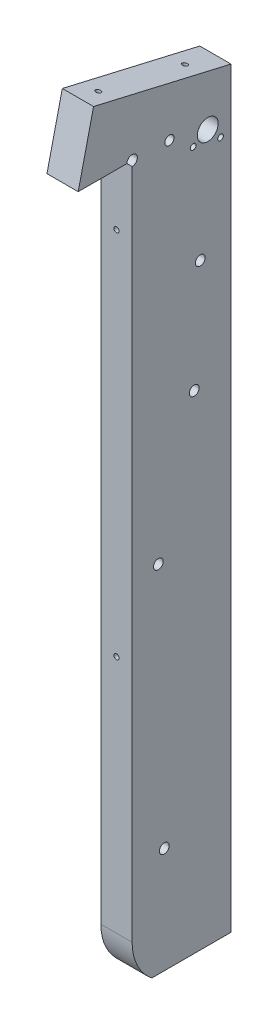
ISO-10303-21;
HEADER;
FILE_DESCRIPTION(('STEP AP214'),'2;1');
FILE_NAME('part.step','',(''),(''),'','','');
FILE_SCHEMA(('AUTOMOTIVE_DESIGN { 1 0 10303 214 1 1 1 1 }'));
ENDSEC;
DATA;
#1=APPLICATION_CONTEXT('core data for automotive mechanical design processes');
#2=APPLICATION_PROTOCOL_DEFINITION('international standard','automotive_design',2000,#1);
#3=PRODUCT_CONTEXT('',#1,'mechanical');
#4=PRODUCT('Part','Part','',(#3));
#5=PRODUCT_RELATED_PRODUCT_CATEGORY('part','',(#4));
#6=PRODUCT_DEFINITION_FORMATION('','',#4);
#7=PRODUCT_DEFINITION_CONTEXT('part definition',#1,'design');
#8=PRODUCT_DEFINITION('design','',#6,#7);
#9=PRODUCT_DEFINITION_SHAPE('','',#8);
#10=(LENGTH_UNIT() NAMED_UNIT(*) SI_UNIT(.MILLI.,.METRE.));
#11=(NAMED_UNIT(*) PLANE_ANGLE_UNIT() SI_UNIT($,.RADIAN.));
#12=(NAMED_UNIT(*) SI_UNIT($,.STERADIAN.) SOLID_ANGLE_UNIT());
#13=UNCERTAINTY_MEASURE_WITH_UNIT(LENGTH_MEASURE(1.E-05),#10,'distance_accuracy_value','');
#14=(GEOMETRIC_REPRESENTATION_CONTEXT(3) GLOBAL_UNCERTAINTY_ASSIGNED_CONTEXT((#13)) GLOBAL_UNIT_ASSIGNED_CONTEXT((#10,
#11,#12)) REPRESENTATION_CONTEXT('',''));
#15=CARTESIAN_POINT('',(0.,0.,0.));
#16=DIRECTION('',(0.,0.,1.));
#17=DIRECTION('',(1.,0.,0.));
#18=AXIS2_PLACEMENT_3D('',#15,#16,#17);
#19=CARTESIAN_POINT('',(-228.088766336441,1.77635683940025E-12,66.675));
#20=DIRECTION('',(1.,0.,0.));
#21=DIRECTION('',(0.,1.,0.));
#22=AXIS2_PLACEMENT_3D('',#19,#20,#21);
#23=PLANE('',#22);
#24=CARTESIAN_POINT('',(-228.088766336441,-221.06944442262,44.3140248027106));
#25=DIRECTION('',(-1.,0.,0.));
#26=DIRECTION('',(0.,0.,1.));
#27=AXIS2_PLACEMENT_3D('',#24,#25,#26);
#28=CIRCLE('',#27,2.97662600000001);
#29=CARTESIAN_POINT('',(-228.088766336441,-221.06944442262,47.2906508027106));
#30=VERTEX_POINT('',#29);
#31=EDGE_CURVE('E282',#30,#30,#28,.T.);
#32=ORIENTED_EDGE('',*,*,#31,.F.);
#33=EDGE_LOOP('',(#32));
#34=FACE_BOUND('',#33,.T.);
#35=CARTESIAN_POINT('',(-228.088766336441,-73.4835711186936,18.7555467062765));
#36=DIRECTION('',(-1.,0.,0.));
#37=DIRECTION('',(0.,0.,1.));
#38=AXIS2_PLACEMENT_3D('',#35,#36,#37);
#39=CIRCLE('',#38,2.976626);
#40=CARTESIAN_POINT('',(-228.088766336441,-73.4835711186936,21.7321727062765));
#41=VERTEX_POINT('',#40);
#42=EDGE_CURVE('E268',#41,#41,#39,.T.);
#43=ORIENTED_EDGE('',*,*,#42,.F.);
#44=EDGE_LOOP('',(#43));
#45=FACE_BOUND('',#44,.T.);
#46=CARTESIAN_POINT('',(-228.088766336441,-14.702641458656,6.3977457230477));
#47=DIRECTION('',(-1.,0.,0.));
#48=DIRECTION('',(0.,0.,1.));
#49=AXIS2_PLACEMENT_3D('',#46,#47,#48);
#50=CIRCLE('',#49,1.7272);
#51=CARTESIAN_POINT('',(-228.088766336441,-14.702641458656,8.1249457230477));
#52=VERTEX_POINT('',#51);
#53=EDGE_CURVE('E196',#52,#52,#50,.T.);
#54=ORIENTED_EDGE('',*,*,#53,.F.);
#55=EDGE_LOOP('',(#54));
#56=FACE_BOUND('',#55,.T.);
#57=DIRECTION('',(0.,-1.,0.));
#58=VECTOR('',#57,1.);
#59=CARTESIAN_POINT('',(-228.088766336441,1.77635683940025E-12,0.));
#60=LINE('',#59,#58);
#61=CARTESIAN_POINT('',(-228.088766336441,20.8246330030021,0.));
#62=VERTEX_POINT('',#61);
#63=CARTESIAN_POINT('',(-228.088766336441,-437.642,0.));
#64=VERTEX_POINT('',#63);
#65=EDGE_CURVE('E142',#62,#64,#60,.T.);
#66=ORIENTED_EDGE('',*,*,#65,.T.);
#67=DIRECTION('',(0.,0.,-1.));
#68=VECTOR('',#67,1.);
#69=CARTESIAN_POINT('',(-228.088766336441,-437.642,0.));
#70=LINE('',#69,#68);
#71=CARTESIAN_POINT('',(-228.088766336441,-437.642,48.2841561463194));
#72=VERTEX_POINT('',#71);
#73=EDGE_CURVE('E124',#72,#64,#70,.T.);
#74=ORIENTED_EDGE('',*,*,#73,.F.);
#75=CARTESIAN_POINT('',(-228.088766336441,-412.75,28.575));
#76=DIRECTION('',(1.,0.,0.));
#77=DIRECTION('',(0.,-1.,0.));
#78=AXIS2_PLACEMENT_3D('',#75,#76,#77);
#79=CIRCLE('',#78,31.75);
#80=CARTESIAN_POINT('',(-228.088766336441,-412.75,60.325));
#81=VERTEX_POINT('',#80);
#82=EDGE_CURVE('E253',#81,#72,#79,.T.);
#83=ORIENTED_EDGE('',*,*,#82,.F.);
#84=DIRECTION('',(0.,-1.,0.));
#85=VECTOR('',#84,1.);
#86=CARTESIAN_POINT('',(-228.088766336441,1.77635683940025E-12,60.325));
#87=LINE('',#86,#85);
#88=CARTESIAN_POINT('',(-228.088766336441,-3.17500000000002,60.325));
#89=VERTEX_POINT('',#88);
#90=EDGE_CURVE('E251',#89,#81,#87,.T.);
#91=ORIENTED_EDGE('',*,*,#90,.F.);
#92=CARTESIAN_POINT('',(-228.088766336441,0.,60.325));
#93=DIRECTION('',(-1.,0.,0.));
#94=DIRECTION('',(0.,0.,1.));
#95=AXIS2_PLACEMENT_3D('',#92,#93,#94);
#96=CIRCLE('',#95,3.175);
#97=CARTESIAN_POINT('',(-228.088766336441,0.,63.5));
#98=VERTEX_POINT('',#97);
#99=EDGE_CURVE('E220',#98,#89,#96,.T.);
#100=ORIENTED_EDGE('',*,*,#99,.F.);
#101=DIRECTION('',(0.,0.,1.));
#102=VECTOR('',#101,1.);
#103=CARTESIAN_POINT('',(-228.088766336441,0.,93.1961939808879));
#104=LINE('',#103,#102);
#105=CARTESIAN_POINT('',(-228.088766336441,0.,93.1961939808879));
#106=VERTEX_POINT('',#105);
#107=EDGE_CURVE('E225',#98,#106,#104,.T.);
#108=ORIENTED_EDGE('',*,*,#107,.T.);
#109=DIRECTION('',(0.,0.974040610761285,-0.226373338950907));
#110=VECTOR('',#109,1.);
#111=CARTESIAN_POINT('',(-228.088766336441,40.3069419106757,83.8285999376698));
#112=LINE('',#111,#110);
#113=CARTESIAN_POINT('',(-228.088766336441,40.3069419106757,83.8285999376698));
#114=VERTEX_POINT('',#113);
#115=EDGE_CURVE('E229',#106,#114,#112,.T.);
#116=ORIENTED_EDGE('',*,*,#115,.T.);
#117=DIRECTION('',(0.,-0.22637333895091,-0.974040610761285));
#118=VECTOR('',#117,1.);
#119=CARTESIAN_POINT('',(-228.088766336441,34.8445532417902,60.325));
#120=LINE('',#119,#118);
#121=EDGE_CURVE('E239',#114,#62,#120,.T.);
#122=ORIENTED_EDGE('',*,*,#121,.T.);
#123=EDGE_LOOP('',(#66,#74,#83,#91,#100,#108,#116,#122));
#124=FACE_BOUND('',#123,.T.);
#125=CARTESIAN_POINT('',(-228.088766336441,-0.660555349790043,37.580125219682));
#126=DIRECTION('',(-1.,0.,0.));
#127=DIRECTION('',(0.,0.,1.));
#128=AXIS2_PLACEMENT_3D('',#125,#126,#127);
#129=CIRCLE('',#128,6.35000000000001);
#130=CARTESIAN_POINT('',(-228.088766336441,-0.660555349790043,43.930125219682));
#131=VERTEX_POINT('',#130);
#132=EDGE_CURVE('E208',#131,#131,#129,.T.);
#133=ORIENTED_EDGE('',*,*,#132,.F.);
#134=EDGE_LOOP('',(#133));
#135=FACE_BOUND('',#134,.T.);
#136=CARTESIAN_POINT('',(-228.088766336441,-6.64676298919709,14.175520602931));
#137=DIRECTION('',(-1.,0.,0.));
#138=DIRECTION('',(0.,0.,1.));
#139=AXIS2_PLACEMENT_3D('',#136,#137,#138);
#140=CIRCLE('',#139,6.34999999999999);
#141=CARTESIAN_POINT('',(-228.088766336441,-6.64676298919709,20.525520602931));
#142=VERTEX_POINT('',#141);
#143=EDGE_CURVE('E202',#142,#142,#140,.T.);
#144=ORIENTED_EDGE('',*,*,#143,.F.);
#145=EDGE_LOOP('',(#144));
#146=FACE_BOUND('',#145,.T.);
#147=CARTESIAN_POINT('',(-228.088766336441,-11.3615710804625,23.0813543140016));
#148=DIRECTION('',(-1.,0.,0.));
#149=DIRECTION('',(0.,0.,1.));
#150=AXIS2_PLACEMENT_3D('',#147,#148,#149);
#151=CIRCLE('',#150,1.7272);
#152=CARTESIAN_POINT('',(-228.088766336441,-11.3615710804625,24.8085543140016));
#153=VERTEX_POINT('',#152);
#154=EDGE_CURVE('E151',#153,#153,#151,.T.);
#155=ORIENTED_EDGE('',*,*,#154,.F.);
#156=EDGE_LOOP('',(#155));
#157=FACE_BOUND('',#156,.T.);
#158=CARTESIAN_POINT('',(-228.088766336441,-140.390130184137,22.4342058235592));
#159=DIRECTION('',(-1.,0.,0.));
#160=DIRECTION('',(0.,0.,1.));
#161=AXIS2_PLACEMENT_3D('',#158,#159,#160);
#162=CIRCLE('',#161,2.97662600000001);
#163=CARTESIAN_POINT('',(-228.088766336441,-140.390130184137,25.4108318235592));
#164=VERTEX_POINT('',#163);
#165=EDGE_CURVE('E276',#164,#164,#162,.T.);
#166=ORIENTED_EDGE('',*,*,#165,.F.);
#167=EDGE_LOOP('',(#166));
#168=FACE_BOUND('',#167,.T.);
#169=CARTESIAN_POINT('',(-228.088766336441,-372.979496158125,40.7001794179415));
#170=DIRECTION('',(-1.,0.,0.));
#171=DIRECTION('',(0.,0.,1.));
#172=AXIS2_PLACEMENT_3D('',#169,#170,#171);
#173=CIRCLE('',#172,2.97662599999998);
#174=CARTESIAN_POINT('',(-228.088766336441,-372.979496158125,43.6768054179414));
#175=VERTEX_POINT('',#174);
#176=EDGE_CURVE('E288',#175,#175,#173,.T.);
#177=ORIENTED_EDGE('',*,*,#176,.F.);
#178=EDGE_LOOP('',(#177));
#179=FACE_BOUND('',#178,.T.);
#180=ADVANCED_FACE('F37',(#34,#45,#56,#124,#135,#146,#157,#168,#179),#23,.F.);
#181=CARTESIAN_POINT('',(-209.038766336441,0.,66.675));
#182=DIRECTION('',(-1.,0.,0.));
#183=DIRECTION('',(0.,-1.,0.));
#184=AXIS2_PLACEMENT_3D('',#181,#182,#183);
#185=PLANE('',#184);
#186=CARTESIAN_POINT('',(-209.038766336441,-372.979496158125,40.7001794179415));
#187=DIRECTION('',(-1.,0.,0.));
#188=DIRECTION('',(0.,-1.,0.));
#189=AXIS2_PLACEMENT_3D('',#186,#187,#188);
#190=CIRCLE('',#189,2.97662599999998);
#191=CARTESIAN_POINT('',(-209.038766336441,-375.956122158125,40.7001794179415));
#192=VERTEX_POINT('',#191);
#193=EDGE_CURVE('E285',#192,#192,#190,.T.);
#194=ORIENTED_EDGE('',*,*,#193,.T.);
#195=EDGE_LOOP('',(#194));
#196=FACE_BOUND('',#195,.T.);
#197=CARTESIAN_POINT('',(-209.038766336441,-221.06944442262,44.3140248027106));
#198=DIRECTION('',(-1.,0.,0.));
#199=DIRECTION('',(0.,-1.,0.));
#200=AXIS2_PLACEMENT_3D('',#197,#198,#199);
#201=CIRCLE('',#200,2.976626);
#202=CARTESIAN_POINT('',(-209.038766336441,-224.04607042262,44.3140248027106));
#203=VERTEX_POINT('',#202);
#204=EDGE_CURVE('E279',#203,#203,#201,.T.);
#205=ORIENTED_EDGE('',*,*,#204,.T.);
#206=EDGE_LOOP('',(#205));
#207=FACE_BOUND('',#206,.T.);
#208=CARTESIAN_POINT('',(-209.038766336441,-140.390130184137,22.4342058235592));
#209=DIRECTION('',(-1.,0.,0.));
#210=DIRECTION('',(0.,-1.,0.));
#211=AXIS2_PLACEMENT_3D('',#208,#209,#210);
#212=CIRCLE('',#211,2.976626);
#213=CARTESIAN_POINT('',(-209.038766336441,-143.366756184137,22.4342058235592));
#214=VERTEX_POINT('',#213);
#215=EDGE_CURVE('E273',#214,#214,#212,.T.);
#216=ORIENTED_EDGE('',*,*,#215,.T.);
#217=EDGE_LOOP('',(#216));
#218=FACE_BOUND('',#217,.T.);
#219=CARTESIAN_POINT('',(-209.038766336441,-73.4835711186936,18.7555467062765));
#220=DIRECTION('',(-1.,0.,0.));
#221=DIRECTION('',(0.,-1.,0.));
#222=AXIS2_PLACEMENT_3D('',#219,#220,#221);
#223=CIRCLE('',#222,2.976626);
#224=CARTESIAN_POINT('',(-209.038766336441,-76.4601971186936,18.7555467062765));
#225=VERTEX_POINT('',#224);
#226=EDGE_CURVE('E265',#225,#225,#223,.T.);
#227=ORIENTED_EDGE('',*,*,#226,.T.);
#228=EDGE_LOOP('',(#227));
#229=FACE_BOUND('',#228,.T.);
#230=CARTESIAN_POINT('',(-209.038766336441,-11.3615710804625,23.0813543140016));
#231=DIRECTION('',(-1.,0.,0.));
#232=DIRECTION('',(0.,-1.,0.));
#233=AXIS2_PLACEMENT_3D('',#230,#231,#232);
#234=CIRCLE('',#233,1.7272);
#235=CARTESIAN_POINT('',(-209.038766336441,-13.0887710804625,23.0813543140016));
#236=VERTEX_POINT('',#235);
#237=EDGE_CURVE('E193',#236,#236,#234,.T.);
#238=ORIENTED_EDGE('',*,*,#237,.T.);
#239=EDGE_LOOP('',(#238));
#240=FACE_BOUND('',#239,.T.);
#241=CARTESIAN_POINT('',(-209.038766336441,-14.702641458656,6.3977457230477));
#242=DIRECTION('',(-1.,0.,0.));
#243=DIRECTION('',(0.,-1.,0.));
#244=AXIS2_PLACEMENT_3D('',#241,#242,#243);
#245=CIRCLE('',#244,1.7272);
#246=CARTESIAN_POINT('',(-209.038766336441,-16.429841458656,6.3977457230477));
#247=VERTEX_POINT('',#246);
#248=EDGE_CURVE('E199',#247,#247,#245,.T.);
#249=ORIENTED_EDGE('',*,*,#248,.T.);
#250=EDGE_LOOP('',(#249));
#251=FACE_BOUND('',#250,.T.);
#252=CARTESIAN_POINT('',(-209.038766336441,-6.64676298919709,14.175520602931));
#253=DIRECTION('',(-1.,0.,0.));
#254=DIRECTION('',(0.,-1.,0.));
#255=AXIS2_PLACEMENT_3D('',#252,#253,#254);
#256=CIRCLE('',#255,6.34999999999999);
#257=CARTESIAN_POINT('',(-209.038766336441,-12.9967629891971,14.175520602931));
#258=VERTEX_POINT('',#257);
#259=EDGE_CURVE('E205',#258,#258,#256,.T.);
#260=ORIENTED_EDGE('',*,*,#259,.T.);
#261=EDGE_LOOP('',(#260));
#262=FACE_BOUND('',#261,.T.);
#263=CARTESIAN_POINT('',(-209.038766336441,-0.660555349790043,37.580125219682));
#264=DIRECTION('',(-1.,0.,0.));
#265=DIRECTION('',(0.,-1.,0.));
#266=AXIS2_PLACEMENT_3D('',#263,#264,#265);
#267=CIRCLE('',#266,2.80670000000001);
#268=CARTESIAN_POINT('',(-209.038766336441,-3.46725534979005,37.580125219682));
#269=VERTEX_POINT('',#268);
#270=EDGE_CURVE('E217',#269,#269,#267,.T.);
#271=ORIENTED_EDGE('',*,*,#270,.T.);
#272=EDGE_LOOP('',(#271));
#273=FACE_BOUND('',#272,.T.);
#274=CARTESIAN_POINT('',(-209.038766336441,-412.75,28.575));
#275=DIRECTION('',(-1.,0.,0.));
#276=DIRECTION('',(0.,-1.,0.));
#277=AXIS2_PLACEMENT_3D('',#274,#275,#276);
#278=CIRCLE('',#277,31.75);
#279=CARTESIAN_POINT('',(-209.038766336441,-437.642,48.2841561463194));
#280=VERTEX_POINT('',#279);
#281=CARTESIAN_POINT('',(-209.038766336441,-412.75,60.325));
#282=VERTEX_POINT('',#281);
#283=EDGE_CURVE('E136',#280,#282,#278,.T.);
#284=ORIENTED_EDGE('',*,*,#283,.F.);
#285=DIRECTION('',(0.,0.,-1.));
#286=VECTOR('',#285,1.);
#287=CARTESIAN_POINT('',(-209.038766336441,-437.642,0.));
#288=LINE('',#287,#286);
#289=CARTESIAN_POINT('',(-209.038766336441,-437.642,0.));
#290=VERTEX_POINT('',#289);
#291=EDGE_CURVE('E53',#280,#290,#288,.T.);
#292=ORIENTED_EDGE('',*,*,#291,.T.);
#293=DIRECTION('',(0.,1.,0.));
#294=VECTOR('',#293,1.);
#295=CARTESIAN_POINT('',(-209.038766336441,0.,0.));
#296=LINE('',#295,#294);
#297=CARTESIAN_POINT('',(-209.038766336441,20.8246330030021,0.));
#298=VERTEX_POINT('',#297);
#299=EDGE_CURVE('E45',#290,#298,#296,.T.);
#300=ORIENTED_EDGE('',*,*,#299,.T.);
#301=DIRECTION('',(0.,-0.22637333895091,-0.974040610761285));
#302=VECTOR('',#301,1.);
#303=CARTESIAN_POINT('',(-209.038766336441,34.8445532417902,60.325));
#304=LINE('',#303,#302);
#305=CARTESIAN_POINT('',(-209.038766336441,40.3069419106757,83.8285999376698));
#306=VERTEX_POINT('',#305);
#307=EDGE_CURVE('E242',#306,#298,#304,.T.);
#308=ORIENTED_EDGE('',*,*,#307,.F.);
#309=DIRECTION('',(0.,0.974040610761285,-0.226373338950907));
#310=VECTOR('',#309,1.);
#311=CARTESIAN_POINT('',(-209.038766336441,40.3069419106757,83.8285999376698));
#312=LINE('',#311,#310);
#313=CARTESIAN_POINT('',(-209.038766336441,0.,93.1961939808879));
#314=VERTEX_POINT('',#313);
#315=EDGE_CURVE('E228',#314,#306,#312,.T.);
#316=ORIENTED_EDGE('',*,*,#315,.F.);
#317=DIRECTION('',(0.,0.,1.));
#318=VECTOR('',#317,1.);
#319=CARTESIAN_POINT('',(-209.038766336441,0.,93.1961939808879));
#320=LINE('',#319,#318);
#321=CARTESIAN_POINT('',(-209.038766336441,8.23179834482838E-13,63.5));
#322=VERTEX_POINT('',#321);
#323=EDGE_CURVE('E226',#322,#314,#320,.T.);
#324=ORIENTED_EDGE('',*,*,#323,.F.);
#325=CARTESIAN_POINT('',(-209.038766336441,0.,60.325));
#326=DIRECTION('',(-1.,0.,0.));
#327=DIRECTION('',(0.,-1.,0.));
#328=AXIS2_PLACEMENT_3D('',#325,#326,#327);
#329=CIRCLE('',#328,3.175);
#330=CARTESIAN_POINT('',(-209.038766336441,-3.17500000000002,60.325));
#331=VERTEX_POINT('',#330);
#332=EDGE_CURVE('E11',#322,#331,#329,.T.);
#333=ORIENTED_EDGE('',*,*,#332,.T.);
#334=DIRECTION('',(0.,1.,0.));
#335=VECTOR('',#334,1.);
#336=CARTESIAN_POINT('',(-209.038766336441,1.77870238100157E-12,60.325));
#337=LINE('',#336,#335);
#338=EDGE_CURVE('E247',#282,#331,#337,.T.);
#339=ORIENTED_EDGE('',*,*,#338,.F.);
#340=EDGE_LOOP('',(#284,#292,#300,#308,#316,#324,#333,#339));
#341=FACE_BOUND('',#340,.T.);
#342=ADVANCED_FACE('F133',(#196,#207,#218,#229,#240,#251,#262,#273,#341),#185,.F.);
#343=CARTESIAN_POINT('',(0.,0.,0.));
#344=DIRECTION('',(0.,0.,1.));
#345=DIRECTION('',(1.,0.,0.));
#346=AXIS2_PLACEMENT_3D('',#343,#344,#345);
#347=PLANE('',#346);
#348=CARTESIAN_POINT('',(-218.563766336441,-31.7499999999982,0.));
#349=DIRECTION('',(0.,0.,1.));
#350=DIRECTION('',(1.,0.,0.));
#351=AXIS2_PLACEMENT_3D('',#348,#349,#350);
#352=CIRCLE('',#351,1.58749999999999);
#353=CARTESIAN_POINT('',(-216.976266336441,-31.7499999999982,0.));
#354=VERTEX_POINT('',#353);
#355=EDGE_CURVE('E165',#354,#354,#352,.T.);
#356=ORIENTED_EDGE('',*,*,#355,.T.);
#357=EDGE_LOOP('',(#356));
#358=FACE_BOUND('',#357,.T.);
#359=CARTESIAN_POINT('',(-218.563766336441,-218.820999999999,0.));
#360=DIRECTION('',(0.,0.,1.));
#361=DIRECTION('',(1.,0.,0.));
#362=AXIS2_PLACEMENT_3D('',#359,#360,#361);
#363=CIRCLE('',#362,1.58749999999999);
#364=CARTESIAN_POINT('',(-216.976266336441,-218.820999999999,0.));
#365=VERTEX_POINT('',#364);
#366=EDGE_CURVE('E161',#365,#365,#363,.T.);
#367=ORIENTED_EDGE('',*,*,#366,.T.);
#368=EDGE_LOOP('',(#367));
#369=FACE_BOUND('',#368,.T.);
#370=CARTESIAN_POINT('',(-218.563766336441,-418.592,0.));
#371=DIRECTION('',(0.,0.,1.));
#372=DIRECTION('',(1.,0.,0.));
#373=AXIS2_PLACEMENT_3D('',#370,#371,#372);
#374=CIRCLE('',#373,1.58749999999999);
#375=CARTESIAN_POINT('',(-216.976266336441,-418.592,0.));
#376=VERTEX_POINT('',#375);
#377=EDGE_CURVE('E157',#376,#376,#374,.T.);
#378=ORIENTED_EDGE('',*,*,#377,.T.);
#379=EDGE_LOOP('',(#378));
#380=FACE_BOUND('',#379,.T.);
#381=ORIENTED_EDGE('',*,*,#299,.F.);
#382=DIRECTION('',(-1.,0.,0.));
#383=VECTOR('',#382,1.);
#384=CARTESIAN_POINT('',(-209.038766336441,-437.642,0.));
#385=LINE('',#384,#383);
#386=EDGE_CURVE('E121',#290,#64,#385,.T.);
#387=ORIENTED_EDGE('',*,*,#386,.T.);
#388=ORIENTED_EDGE('',*,*,#65,.F.);
#389=DIRECTION('',(-1.,0.,0.));
#390=VECTOR('',#389,1.);
#391=CARTESIAN_POINT('',(-209.038766336441,20.8246330030021,0.));
#392=LINE('',#391,#390);
#393=EDGE_CURVE('E140',#298,#62,#392,.T.);
#394=ORIENTED_EDGE('',*,*,#393,.F.);
#395=EDGE_LOOP('',(#381,#387,#388,#394));
#396=FACE_BOUND('',#395,.T.);
#397=ADVANCED_FACE('F138',(#358,#369,#380,#396),#347,.F.);
#398=CARTESIAN_POINT('',(-209.037766336441,-412.75,28.575));
#399=DIRECTION('',(-1.,0.,0.));
#400=DIRECTION('',(0.,-1.,0.));
#401=AXIS2_PLACEMENT_3D('',#398,#399,#400);
#402=CYLINDRICAL_SURFACE('',#401,31.75);
#403=ORIENTED_EDGE('',*,*,#82,.T.);
#404=DIRECTION('',(-1.,0.,0.));
#405=VECTOR('',#404,1.);
#406=CARTESIAN_POINT('',(-209.038766336441,-437.642,48.2841561463194));
#407=LINE('',#406,#405);
#408=EDGE_CURVE('E129',#280,#72,#407,.T.);
#409=ORIENTED_EDGE('',*,*,#408,.F.);
#410=ORIENTED_EDGE('',*,*,#283,.T.);
#411=DIRECTION('',(-1.,0.,0.));
#412=VECTOR('',#411,1.);
#413=CARTESIAN_POINT('',(-209.037766336441,-412.75,60.325));
#414=LINE('',#413,#412);
#415=EDGE_CURVE('E144',#282,#81,#414,.T.);
#416=ORIENTED_EDGE('',*,*,#415,.T.);
#417=EDGE_LOOP('',(#403,#409,#410,#416));
#418=FACE_BOUND('',#417,.T.);
#419=ADVANCED_FACE('F259',(#418),#402,.T.);
#420=CARTESIAN_POINT('',(-209.037766336441,1.77870250412711E-12,60.325));
#421=DIRECTION('',(0.,0.,-1.));
#422=DIRECTION('',(0.,1.,0.));
#423=AXIS2_PLACEMENT_3D('',#420,#421,#422);
#424=PLANE('',#423);
#425=CARTESIAN_POINT('',(-218.563766336441,-266.700000000001,60.325));
#426=DIRECTION('',(0.,0.,-1.));
#427=DIRECTION('',(0.,1.,0.));
#428=AXIS2_PLACEMENT_3D('',#425,#426,#427);
#429=CIRCLE('',#428,1.58749999999999);
#430=CARTESIAN_POINT('',(-218.563766336441,-265.112500000001,60.325));
#431=VERTEX_POINT('',#430);
#432=EDGE_CURVE('E40',#431,#431,#429,.T.);
#433=ORIENTED_EDGE('',*,*,#432,.T.);
#434=EDGE_LOOP('',(#433));
#435=FACE_BOUND('',#434,.T.);
#436=CARTESIAN_POINT('',(-218.563766336441,-41.275,60.325));
#437=DIRECTION('',(0.,0.,-1.));
#438=DIRECTION('',(0.,1.,0.));
#439=AXIS2_PLACEMENT_3D('',#436,#437,#438);
#440=CIRCLE('',#439,1.58749999999999);
#441=CARTESIAN_POINT('',(-218.563766336441,-39.6875,60.325));
#442=VERTEX_POINT('',#441);
#443=EDGE_CURVE('E168',#442,#442,#440,.T.);
#444=ORIENTED_EDGE('',*,*,#443,.T.);
#445=EDGE_LOOP('',(#444));
#446=FACE_BOUND('',#445,.T.);
#447=ORIENTED_EDGE('',*,*,#338,.T.);
#448=DIRECTION('',(-1.,0.,0.));
#449=VECTOR('',#448,1.);
#450=CARTESIAN_POINT('',(-228.088766336441,-3.17500000000002,60.325));
#451=LINE('',#450,#449);
#452=EDGE_CURVE('E61',#331,#89,#451,.T.);
#453=ORIENTED_EDGE('',*,*,#452,.T.);
#454=ORIENTED_EDGE('',*,*,#90,.T.);
#455=ORIENTED_EDGE('',*,*,#415,.F.);
#456=EDGE_LOOP('',(#447,#453,#454,#455));
#457=FACE_BOUND('',#456,.T.);
#458=ADVANCED_FACE('F350',(#435,#446,#457),#424,.F.);
#459=CARTESIAN_POINT('',(-209.038766336441,34.8445532417902,60.325));
#460=DIRECTION('',(0.,0.974040610761285,-0.22637333895091));
#461=DIRECTION('',(0.,0.22637333895091,0.974040610761285));
#462=AXIS2_PLACEMENT_3D('',#459,#460,#461);
#463=PLANE('',#462);
#464=CARTESIAN_POINT('',(-218.563766336441,37.4320005059991,71.4582841810015));
#465=DIRECTION('',(0.,0.974040610761285,-0.22637333895091));
#466=DIRECTION('',(0.,0.22637333895091,0.974040610761285));
#467=AXIS2_PLACEMENT_3D('',#464,#465,#466);
#468=CIRCLE('',#467,1.58749999999999);
#469=CARTESIAN_POINT('',(-218.563766336441,37.7913681815837,73.004573650585));
#470=VERTEX_POINT('',#469);
#471=EDGE_CURVE('E153',#470,#470,#468,.T.);
#472=ORIENTED_EDGE('',*,*,#471,.F.);
#473=EDGE_LOOP('',(#472));
#474=FACE_BOUND('',#473,.T.);
#475=CARTESIAN_POINT('',(-218.563766336441,25.137045110017,18.5554736350028));
#476=DIRECTION('',(0.,0.974040610761285,-0.22637333895091));
#477=DIRECTION('',(0.,0.22637333895091,0.974040610761285));
#478=AXIS2_PLACEMENT_3D('',#475,#476,#477);
#479=CIRCLE('',#478,1.58749999999999);
#480=CARTESIAN_POINT('',(-218.563766336441,25.4964127856015,20.1017631045863));
#481=VERTEX_POINT('',#480);
#482=EDGE_CURVE('E148',#481,#481,#479,.T.);
#483=ORIENTED_EDGE('',*,*,#482,.F.);
#484=EDGE_LOOP('',(#483));
#485=FACE_BOUND('',#484,.T.);
#486=ORIENTED_EDGE('',*,*,#121,.F.);
#487=DIRECTION('',(-1.,0.,0.));
#488=VECTOR('',#487,1.);
#489=CARTESIAN_POINT('',(-209.038766336441,40.3069419106757,83.8285999376698));
#490=LINE('',#489,#488);
#491=EDGE_CURVE('E236',#306,#114,#490,.T.);
#492=ORIENTED_EDGE('',*,*,#491,.F.);
#493=ORIENTED_EDGE('',*,*,#307,.T.);
#494=ORIENTED_EDGE('',*,*,#393,.T.);
#495=EDGE_LOOP('',(#486,#492,#493,#494));
#496=FACE_BOUND('',#495,.T.);
#497=ADVANCED_FACE('F343',(#474,#485,#496),#463,.T.);
#498=CARTESIAN_POINT('',(-209.038766336441,40.3069419106757,83.8285999376698));
#499=DIRECTION('',(0.,0.226373338950907,0.974040610761285));
#500=DIRECTION('',(0.,-0.974040610761285,0.226373338950907));
#501=AXIS2_PLACEMENT_3D('',#498,#499,#500);
#502=PLANE('',#501);
#503=ORIENTED_EDGE('',*,*,#115,.F.);
#504=DIRECTION('',(-1.,0.,0.));
#505=VECTOR('',#504,1.);
#506=CARTESIAN_POINT('',(-209.038766336441,0.,93.1961939808879));
#507=LINE('',#506,#505);
#508=EDGE_CURVE('E232',#314,#106,#507,.T.);
#509=ORIENTED_EDGE('',*,*,#508,.F.);
#510=ORIENTED_EDGE('',*,*,#315,.T.);
#511=ORIENTED_EDGE('',*,*,#491,.T.);
#512=EDGE_LOOP('',(#503,#509,#510,#511));
#513=FACE_BOUND('',#512,.T.);
#514=ADVANCED_FACE('F340',(#513),#502,.T.);
#515=CARTESIAN_POINT('',(-209.038766336441,0.,93.1961939808879));
#516=DIRECTION('',(0.,-1.,0.));
#517=DIRECTION('',(0.,0.,-1.));
#518=AXIS2_PLACEMENT_3D('',#515,#516,#517);
#519=PLANE('',#518);
#520=DIRECTION('',(-1.,0.,0.));
#521=VECTOR('',#520,1.);
#522=CARTESIAN_POINT('',(-228.088766336441,8.20834292881518E-13,63.5));
#523=LINE('',#522,#521);
#524=EDGE_CURVE('E222',#322,#98,#523,.T.);
#525=ORIENTED_EDGE('',*,*,#524,.F.);
#526=ORIENTED_EDGE('',*,*,#323,.T.);
#527=ORIENTED_EDGE('',*,*,#508,.T.);
#528=ORIENTED_EDGE('',*,*,#107,.F.);
#529=EDGE_LOOP('',(#525,#526,#527,#528));
#530=FACE_BOUND('',#529,.T.);
#531=ADVANCED_FACE('F339',(#530),#519,.T.);
#532=CARTESIAN_POINT('',(-228.088766336441,0.,60.325));
#533=DIRECTION('',(-1.,0.,0.));
#534=DIRECTION('',(0.,0.,1.));
#535=AXIS2_PLACEMENT_3D('',#532,#533,#534);
#536=CYLINDRICAL_SURFACE('',#535,3.175);
#537=ORIENTED_EDGE('',*,*,#332,.F.);
#538=ORIENTED_EDGE('',*,*,#524,.T.);
#539=ORIENTED_EDGE('',*,*,#99,.T.);
#540=ORIENTED_EDGE('',*,*,#452,.F.);
#541=EDGE_LOOP('',(#537,#538,#539,#540));
#542=FACE_BOUND('',#541,.T.);
#543=ADVANCED_FACE('F335',(#542),#536,.F.);
#544=CARTESIAN_POINT('',(-228.088766336441,-0.660555349790043,37.580125219682));
#545=DIRECTION('',(-1.,0.,0.));
#546=DIRECTION('',(0.,0.,1.));
#547=AXIS2_PLACEMENT_3D('',#544,#545,#546);
#548=CYLINDRICAL_SURFACE('',#547,2.80670000000001);
#549=ORIENTED_EDGE('',*,*,#270,.F.);
#550=EDGE_LOOP('',(#549));
#551=FACE_BOUND('',#550,.T.);
#552=CARTESIAN_POINT('',(-221.738766336441,-0.660555349790043,37.580125219682));
#553=DIRECTION('',(-1.,0.,0.));
#554=DIRECTION('',(0.,0.,1.));
#555=AXIS2_PLACEMENT_3D('',#552,#553,#554);
#556=CIRCLE('',#555,2.80670000000001);
#557=CARTESIAN_POINT('',(-221.738766336441,-0.660555349790043,40.386825219682));
#558=VERTEX_POINT('',#557);
#559=EDGE_CURVE('E214',#558,#558,#556,.T.);
#560=ORIENTED_EDGE('',*,*,#559,.T.);
#561=EDGE_LOOP('',(#560));
#562=FACE_BOUND('',#561,.T.);
#563=ADVANCED_FACE('F331',(#551,#562),#548,.F.);
#564=CARTESIAN_POINT('',(-221.738766336441,2.14614465020997,37.580125219682));
#565=DIRECTION('',(1.,0.,0.));
#566=DIRECTION('',(0.,0.,-1.));
#567=AXIS2_PLACEMENT_3D('',#564,#565,#566);
#568=PLANE('',#567);
#569=ORIENTED_EDGE('',*,*,#559,.F.);
#570=EDGE_LOOP('',(#569));
#571=FACE_BOUND('',#570,.T.);
#572=CARTESIAN_POINT('',(-221.738766336441,-0.660555349790043,37.580125219682));
#573=DIRECTION('',(-1.,0.,0.));
#574=DIRECTION('',(0.,0.,1.));
#575=AXIS2_PLACEMENT_3D('',#572,#573,#574);
#576=CIRCLE('',#575,6.35000000000001);
#577=CARTESIAN_POINT('',(-221.738766336441,-0.660555349790043,43.930125219682));
#578=VERTEX_POINT('',#577);
#579=EDGE_CURVE('E211',#578,#578,#576,.T.);
#580=ORIENTED_EDGE('',*,*,#579,.T.);
#581=EDGE_LOOP('',(#580));
#582=FACE_BOUND('',#581,.T.);
#583=ADVANCED_FACE('F327',(#571,#582),#568,.F.);
#584=CARTESIAN_POINT('',(-228.088766336441,-0.660555349790043,37.580125219682));
#585=DIRECTION('',(-1.,0.,0.));
#586=DIRECTION('',(0.,0.,1.));
#587=AXIS2_PLACEMENT_3D('',#584,#585,#586);
#588=CYLINDRICAL_SURFACE('',#587,6.35000000000001);
#589=ORIENTED_EDGE('',*,*,#579,.F.);
#590=EDGE_LOOP('',(#589));
#591=FACE_BOUND('',#590,.T.);
#592=ORIENTED_EDGE('',*,*,#132,.T.);
#593=EDGE_LOOP('',(#592));
#594=FACE_BOUND('',#593,.T.);
#595=ADVANCED_FACE('F319',(#591,#594),#588,.F.);
#596=CARTESIAN_POINT('',(-228.088766336441,-6.64676298919709,14.175520602931));
#597=DIRECTION('',(-1.,0.,0.));
#598=DIRECTION('',(0.,0.,1.));
#599=AXIS2_PLACEMENT_3D('',#596,#597,#598);
#600=CYLINDRICAL_SURFACE('',#599,6.34999999999999);
#601=ORIENTED_EDGE('',*,*,#259,.F.);
#602=EDGE_LOOP('',(#601));
#603=FACE_BOUND('',#602,.T.);
#604=ORIENTED_EDGE('',*,*,#143,.T.);
#605=EDGE_LOOP('',(#604));
#606=FACE_BOUND('',#605,.T.);
#607=ADVANCED_FACE('F309',(#603,#606),#600,.F.);
#608=CARTESIAN_POINT('',(-228.088766336441,-14.702641458656,6.3977457230477));
#609=DIRECTION('',(-1.,0.,0.));
#610=DIRECTION('',(0.,0.,1.));
#611=AXIS2_PLACEMENT_3D('',#608,#609,#610);
#612=CYLINDRICAL_SURFACE('',#611,1.7272);
#613=ORIENTED_EDGE('',*,*,#248,.F.);
#614=EDGE_LOOP('',(#613));
#615=FACE_BOUND('',#614,.T.);
#616=ORIENTED_EDGE('',*,*,#53,.T.);
#617=EDGE_LOOP('',(#616));
#618=FACE_BOUND('',#617,.T.);
#619=ADVANCED_FACE('F306',(#615,#618),#612,.F.);
#620=CARTESIAN_POINT('',(-228.088766336441,-11.3615710804625,23.0813543140016));
#621=DIRECTION('',(-1.,0.,0.));
#622=DIRECTION('',(0.,0.,1.));
#623=AXIS2_PLACEMENT_3D('',#620,#621,#622);
#624=CYLINDRICAL_SURFACE('',#623,1.7272);
#625=ORIENTED_EDGE('',*,*,#237,.F.);
#626=EDGE_LOOP('',(#625));
#627=FACE_BOUND('',#626,.T.);
#628=ORIENTED_EDGE('',*,*,#154,.T.);
#629=EDGE_LOOP('',(#628));
#630=FACE_BOUND('',#629,.T.);
#631=ADVANCED_FACE('F308',(#627,#630),#624,.F.);
#632=CARTESIAN_POINT('',(-218.563766336441,6.58157147501348,22.8678857420179));
#633=DIRECTION('',(0.,0.974040610761284,-0.226373338950912));
#634=DIRECTION('',(0.,0.226373338950912,0.974040610761284));
#635=AXIS2_PLACEMENT_3D('',#632,#633,#634);
#636=CONICAL_SURFACE('',#635,1.58749999999999,1.02974425867665);
#637=CARTESIAN_POINT('',(-218.563766336441,5.65246702712373,23.0838156260281));
#638=VERTEX_POINT('',#637);
#639=VERTEX_LOOP('',#638);
#640=FACE_BOUND('',#639,.T.);
#641=CARTESIAN_POINT('',(-218.563766336441,6.58157147501348,22.8678857420179));
#642=DIRECTION('',(0.,0.974040610761284,-0.226373338950912));
#643=DIRECTION('',(0.,0.226373338950912,0.974040610761284));
#644=AXIS2_PLACEMENT_3D('',#641,#642,#643);
#645=CIRCLE('',#644,1.58749999999999);
#646=CARTESIAN_POINT('',(-218.563766336441,6.94093915059805,24.4141752116014));
#647=VERTEX_POINT('',#646);
#648=EDGE_CURVE('E152',#647,#647,#645,.T.);
#649=ORIENTED_EDGE('',*,*,#648,.T.);
#650=EDGE_LOOP('',(#649));
#651=FACE_BOUND('',#650,.T.);
#652=ADVANCED_FACE('F316',(#640,#651),#636,.F.);
#653=CARTESIAN_POINT('',(-218.563766336441,56.0628345016867,11.3681201233116));
#654=DIRECTION('',(0.,0.974040610761284,-0.226373338950912));
#655=DIRECTION('',(0.,0.226373338950912,0.974040610761284));
#656=AXIS2_PLACEMENT_3D('',#653,#654,#655);
#657=CYLINDRICAL_SURFACE('',#656,1.58749999999999);
#658=ORIENTED_EDGE('',*,*,#482,.T.);
#659=EDGE_LOOP('',(#658));
#660=FACE_BOUND('',#659,.T.);
#661=ORIENTED_EDGE('',*,*,#648,.F.);
#662=EDGE_LOOP('',(#661));
#663=FACE_BOUND('',#662,.T.);
#664=ADVANCED_FACE('F390',(#660,#663),#657,.F.);
#665=CARTESIAN_POINT('',(-218.563766336441,18.8765268709957,75.7706962880166));
#666=DIRECTION('',(0.,0.974040610761284,-0.226373338950912));
#667=DIRECTION('',(0.,0.226373338950912,0.974040610761284));
#668=AXIS2_PLACEMENT_3D('',#665,#666,#667);
#669=CONICAL_SURFACE('',#668,1.58749999999999,1.02974425867665);
#670=CARTESIAN_POINT('',(-218.563766336441,17.9474224231059,75.9866261720268));
#671=VERTEX_POINT('',#670);
#672=VERTEX_LOOP('',#671);
#673=FACE_BOUND('',#672,.T.);
#674=CARTESIAN_POINT('',(-218.563766336441,18.8765268709957,75.7706962880166));
#675=DIRECTION('',(0.,0.974040610761284,-0.226373338950912));
#676=DIRECTION('',(0.,0.226373338950912,0.974040610761284));
#677=AXIS2_PLACEMENT_3D('',#674,#675,#676);
#678=CIRCLE('',#677,1.58749999999999);
#679=CARTESIAN_POINT('',(-218.563766336441,19.2358945465802,77.3169857576001));
#680=VERTEX_POINT('',#679);
#681=EDGE_CURVE('E156',#680,#680,#678,.T.);
#682=ORIENTED_EDGE('',*,*,#681,.T.);
#683=EDGE_LOOP('',(#682));
#684=FACE_BOUND('',#683,.T.);
#685=ADVANCED_FACE('F380',(#673,#684),#669,.F.);
#686=CARTESIAN_POINT('',(-218.563766336441,68.3577898976689,64.2709306693103));
#687=DIRECTION('',(0.,0.974040610761284,-0.226373338950912));
#688=DIRECTION('',(0.,0.226373338950912,0.974040610761284));
#689=AXIS2_PLACEMENT_3D('',#686,#687,#688);
#690=CYLINDRICAL_SURFACE('',#689,1.58749999999999);
#691=ORIENTED_EDGE('',*,*,#471,.T.);
#692=EDGE_LOOP('',(#691));
#693=FACE_BOUND('',#692,.T.);
#694=ORIENTED_EDGE('',*,*,#681,.F.);
#695=EDGE_LOOP('',(#694));
#696=FACE_BOUND('',#695,.T.);
#697=ADVANCED_FACE('F370',(#693,#696),#690,.F.);
#698=CARTESIAN_POINT('',(-218.563766336441,-418.592,-25.4));
#699=DIRECTION('',(0.,0.,-1.));
#700=DIRECTION('',(-1.,0.,0.));
#701=AXIS2_PLACEMENT_3D('',#698,#699,#700);
#702=CYLINDRICAL_SURFACE('',#701,1.58749999999999);
#703=CARTESIAN_POINT('',(-218.563766336441,-418.592,12.7));
#704=DIRECTION('',(0.,0.,-1.));
#705=DIRECTION('',(-1.,0.,0.));
#706=AXIS2_PLACEMENT_3D('',#703,#704,#705);
#707=CIRCLE('',#706,1.58749999999999);
#708=CARTESIAN_POINT('',(-220.151266336441,-418.592,12.7));
#709=VERTEX_POINT('',#708);
#710=EDGE_CURVE('E160',#709,#709,#707,.T.);
#711=ORIENTED_EDGE('',*,*,#710,.F.);
#712=EDGE_LOOP('',(#711));
#713=FACE_BOUND('',#712,.T.);
#714=ORIENTED_EDGE('',*,*,#377,.F.);
#715=EDGE_LOOP('',(#714));
#716=FACE_BOUND('',#715,.T.);
#717=ADVANCED_FACE('F367',(#713,#716),#702,.F.);
#718=CARTESIAN_POINT('',(-218.563766336441,-418.592,12.7));
#719=DIRECTION('',(0.,0.,-1.));
#720=DIRECTION('',(-1.,0.,0.));
#721=AXIS2_PLACEMENT_3D('',#718,#719,#720);
#722=CONICAL_SURFACE('',#721,1.58749999999999,1.02974425867665);
#723=CARTESIAN_POINT('',(-218.563766336441,-418.592,13.6538662327062));
#724=VERTEX_POINT('',#723);
#725=VERTEX_LOOP('',#724);
#726=FACE_BOUND('',#725,.T.);
#727=ORIENTED_EDGE('',*,*,#710,.T.);
#728=EDGE_LOOP('',(#727));
#729=FACE_BOUND('',#728,.T.);
#730=ADVANCED_FACE('F369',(#726,#729),#722,.F.);
#731=CARTESIAN_POINT('',(-218.563766336441,-218.820999999999,-25.4));
#732=DIRECTION('',(0.,0.,-1.));
#733=DIRECTION('',(-1.,0.,0.));
#734=AXIS2_PLACEMENT_3D('',#731,#732,#733);
#735=CYLINDRICAL_SURFACE('',#734,1.58749999999999);
#736=CARTESIAN_POINT('',(-218.563766336441,-218.820999999999,12.7));
#737=DIRECTION('',(0.,0.,-1.));
#738=DIRECTION('',(-1.,0.,0.));
#739=AXIS2_PLACEMENT_3D('',#736,#737,#738);
#740=CIRCLE('',#739,1.58749999999999);
#741=CARTESIAN_POINT('',(-220.151266336441,-218.820999999999,12.7));
#742=VERTEX_POINT('',#741);
#743=EDGE_CURVE('E164',#742,#742,#740,.T.);
#744=ORIENTED_EDGE('',*,*,#743,.F.);
#745=EDGE_LOOP('',(#744));
#746=FACE_BOUND('',#745,.T.);
#747=ORIENTED_EDGE('',*,*,#366,.F.);
#748=EDGE_LOOP('',(#747));
#749=FACE_BOUND('',#748,.T.);
#750=ADVANCED_FACE('F377',(#746,#749),#735,.F.);
#751=CARTESIAN_POINT('',(-218.563766336441,-218.820999999999,12.7));
#752=DIRECTION('',(0.,0.,-1.));
#753=DIRECTION('',(-1.,0.,0.));
#754=AXIS2_PLACEMENT_3D('',#751,#752,#753);
#755=CONICAL_SURFACE('',#754,1.58749999999999,1.02974425867665);
#756=CARTESIAN_POINT('',(-218.563766336441,-218.820999999999,13.6538662327062));
#757=VERTEX_POINT('',#756);
#758=VERTEX_LOOP('',#757);
#759=FACE_BOUND('',#758,.T.);
#760=ORIENTED_EDGE('',*,*,#743,.T.);
#761=EDGE_LOOP('',(#760));
#762=FACE_BOUND('',#761,.T.);
#763=ADVANCED_FACE('F385',(#759,#762),#755,.F.);
#764=CARTESIAN_POINT('',(-218.563766336441,-31.7499999999982,-25.4));
#765=DIRECTION('',(0.,0.,-1.));
#766=DIRECTION('',(-1.,0.,0.));
#767=AXIS2_PLACEMENT_3D('',#764,#765,#766);
#768=CYLINDRICAL_SURFACE('',#767,1.58749999999999);
#769=CARTESIAN_POINT('',(-218.563766336441,-31.7499999999982,12.7));
#770=DIRECTION('',(0.,0.,-1.));
#771=DIRECTION('',(-1.,0.,0.));
#772=AXIS2_PLACEMENT_3D('',#769,#770,#771);
#773=CIRCLE('',#772,1.58749999999999);
#774=CARTESIAN_POINT('',(-220.151266336441,-31.7499999999982,12.7));
#775=VERTEX_POINT('',#774);
#776=EDGE_CURVE('E167',#775,#775,#773,.T.);
#777=ORIENTED_EDGE('',*,*,#776,.F.);
#778=EDGE_LOOP('',(#777));
#779=FACE_BOUND('',#778,.T.);
#780=ORIENTED_EDGE('',*,*,#355,.F.);
#781=EDGE_LOOP('',(#780));
#782=FACE_BOUND('',#781,.T.);
#783=ADVANCED_FACE('F457',(#779,#782),#768,.F.);
#784=CARTESIAN_POINT('',(-218.563766336441,-31.7499999999982,12.7));
#785=DIRECTION('',(0.,0.,-1.));
#786=DIRECTION('',(-1.,0.,0.));
#787=AXIS2_PLACEMENT_3D('',#784,#785,#786);
#788=CONICAL_SURFACE('',#787,1.58749999999999,1.02974425867665);
#789=CARTESIAN_POINT('',(-218.563766336441,-31.7499999999982,13.6538662327062));
#790=VERTEX_POINT('',#789);
#791=VERTEX_LOOP('',#790);
#792=FACE_BOUND('',#791,.T.);
#793=ORIENTED_EDGE('',*,*,#776,.T.);
#794=EDGE_LOOP('',(#793));
#795=FACE_BOUND('',#794,.T.);
#796=ADVANCED_FACE('F467',(#792,#795),#788,.F.);
#797=CARTESIAN_POINT('',(-218.563766336441,-41.275,66.6749999999975));
#798=DIRECTION('',(0.,0.,1.));
#799=DIRECTION('',(1.,0.,0.));
#800=AXIS2_PLACEMENT_3D('',#797,#798,#799);
#801=CYLINDRICAL_SURFACE('',#800,1.58749999999999);
#802=CARTESIAN_POINT('',(-218.563766336441,-41.275,28.5749999999975));
#803=DIRECTION('',(0.,0.,1.));
#804=DIRECTION('',(1.,0.,0.));
#805=AXIS2_PLACEMENT_3D('',#802,#803,#804);
#806=CIRCLE('',#805,1.58749999999999);
#807=CARTESIAN_POINT('',(-216.976266336441,-41.275,28.5749999999975));
#808=VERTEX_POINT('',#807);
#809=EDGE_CURVE('E170',#808,#808,#806,.T.);
#810=ORIENTED_EDGE('',*,*,#809,.F.);
#811=EDGE_LOOP('',(#810));
#812=FACE_BOUND('',#811,.T.);
#813=ORIENTED_EDGE('',*,*,#443,.F.);
#814=EDGE_LOOP('',(#813));
#815=FACE_BOUND('',#814,.T.);
#816=ADVANCED_FACE('F477',(#812,#815),#801,.F.);
#817=CARTESIAN_POINT('',(-218.563766336441,-41.275,28.5749999999975));
#818=DIRECTION('',(0.,0.,1.));
#819=DIRECTION('',(1.,0.,0.));
#820=AXIS2_PLACEMENT_3D('',#817,#818,#819);
#821=CONICAL_SURFACE('',#820,1.58749999999999,1.02974425867665);
#822=CARTESIAN_POINT('',(-218.563766336441,-41.275,27.6211337672912));
#823=VERTEX_POINT('',#822);
#824=VERTEX_LOOP('',#823);
#825=FACE_BOUND('',#824,.T.);
#826=ORIENTED_EDGE('',*,*,#809,.T.);
#827=EDGE_LOOP('',(#826));
#828=FACE_BOUND('',#827,.T.);
#829=ADVANCED_FACE('F496',(#825,#828),#821,.F.);
#830=CARTESIAN_POINT('',(-218.563766336441,-266.700000000001,66.6749999999975));
#831=DIRECTION('',(0.,0.,1.));
#832=DIRECTION('',(1.,0.,0.));
#833=AXIS2_PLACEMENT_3D('',#830,#831,#832);
#834=CYLINDRICAL_SURFACE('',#833,1.58749999999999);
#835=CARTESIAN_POINT('',(-218.563766336441,-266.700000000001,28.5749999999975));
#836=DIRECTION('',(0.,0.,1.));
#837=DIRECTION('',(1.,0.,0.));
#838=AXIS2_PLACEMENT_3D('',#835,#836,#837);
#839=CIRCLE('',#838,1.58749999999999);
#840=CARTESIAN_POINT('',(-216.976266336441,-266.700000000001,28.5749999999975));
#841=VERTEX_POINT('',#840);
#842=EDGE_CURVE('E128',#841,#841,#839,.T.);
#843=ORIENTED_EDGE('',*,*,#842,.F.);
#844=EDGE_LOOP('',(#843));
#845=FACE_BOUND('',#844,.T.);
#846=ORIENTED_EDGE('',*,*,#432,.F.);
#847=EDGE_LOOP('',(#846));
#848=FACE_BOUND('',#847,.T.);
#849=ADVANCED_FACE('F508',(#845,#848),#834,.F.);
#850=CARTESIAN_POINT('',(-218.563766336441,-266.700000000001,28.5749999999975));
#851=DIRECTION('',(0.,0.,1.));
#852=DIRECTION('',(1.,0.,0.));
#853=AXIS2_PLACEMENT_3D('',#850,#851,#852);
#854=CONICAL_SURFACE('',#853,1.58749999999999,1.02974425867665);
#855=CARTESIAN_POINT('',(-218.563766336441,-266.700000000001,27.6211337672912));
#856=VERTEX_POINT('',#855);
#857=VERTEX_LOOP('',#856);
#858=FACE_BOUND('',#857,.T.);
#859=ORIENTED_EDGE('',*,*,#842,.T.);
#860=EDGE_LOOP('',(#859));
#861=FACE_BOUND('',#860,.T.);
#862=ADVANCED_FACE('F519',(#858,#861),#854,.F.);
#863=CARTESIAN_POINT('',(-209.038766336441,-437.642,0.));
#864=DIRECTION('',(0.,1.,0.));
#865=DIRECTION('',(-1.,0.,0.));
#866=AXIS2_PLACEMENT_3D('',#863,#864,#865);
#867=PLANE('',#866);
#868=ORIENTED_EDGE('',*,*,#73,.T.);
#869=ORIENTED_EDGE('',*,*,#386,.F.);
#870=ORIENTED_EDGE('',*,*,#291,.F.);
#871=ORIENTED_EDGE('',*,*,#408,.T.);
#872=EDGE_LOOP('',(#868,#869,#870,#871));
#873=FACE_BOUND('',#872,.T.);
#874=ADVANCED_FACE('F122',(#873),#867,.F.);
#875=CARTESIAN_POINT('',(-228.088766336441,-73.4835711186936,18.7555467062765));
#876=DIRECTION('',(-1.,0.,0.));
#877=DIRECTION('',(0.,0.,1.));
#878=AXIS2_PLACEMENT_3D('',#875,#876,#877);
#879=CYLINDRICAL_SURFACE('',#878,2.976626);
#880=ORIENTED_EDGE('',*,*,#226,.F.);
#881=EDGE_LOOP('',(#880));
#882=FACE_BOUND('',#881,.T.);
#883=ORIENTED_EDGE('',*,*,#42,.T.);
#884=EDGE_LOOP('',(#883));
#885=FACE_BOUND('',#884,.T.);
#886=ADVANCED_FACE('F548',(#882,#885),#879,.F.);
#887=CARTESIAN_POINT('',(-228.088766336441,-140.390130184137,22.4342058235592));
#888=DIRECTION('',(-1.,0.,0.));
#889=DIRECTION('',(0.,0.,1.));
#890=AXIS2_PLACEMENT_3D('',#887,#888,#889);
#891=CYLINDRICAL_SURFACE('',#890,2.976626);
#892=ORIENTED_EDGE('',*,*,#215,.F.);
#893=EDGE_LOOP('',(#892));
#894=FACE_BOUND('',#893,.T.);
#895=ORIENTED_EDGE('',*,*,#165,.T.);
#896=EDGE_LOOP('',(#895));
#897=FACE_BOUND('',#896,.T.);
#898=ADVANCED_FACE('F572',(#894,#897),#891,.F.);
#899=CARTESIAN_POINT('',(-228.088766336441,-221.06944442262,44.3140248027106));
#900=DIRECTION('',(-1.,0.,0.));
#901=DIRECTION('',(0.,0.,1.));
#902=AXIS2_PLACEMENT_3D('',#899,#900,#901);
#903=CYLINDRICAL_SURFACE('',#902,2.976626);
#904=ORIENTED_EDGE('',*,*,#204,.F.);
#905=EDGE_LOOP('',(#904));
#906=FACE_BOUND('',#905,.T.);
#907=ORIENTED_EDGE('',*,*,#31,.T.);
#908=EDGE_LOOP('',(#907));
#909=FACE_BOUND('',#908,.T.);
#910=ADVANCED_FACE('F584',(#906,#909),#903,.F.);
#911=CARTESIAN_POINT('',(-228.088766336441,-372.979496158125,40.7001794179415));
#912=DIRECTION('',(-1.,0.,0.));
#913=DIRECTION('',(0.,0.,1.));
#914=AXIS2_PLACEMENT_3D('',#911,#912,#913);
#915=CYLINDRICAL_SURFACE('',#914,2.97662599999998);
#916=ORIENTED_EDGE('',*,*,#193,.F.);
#917=EDGE_LOOP('',(#916));
#918=FACE_BOUND('',#917,.T.);
#919=ORIENTED_EDGE('',*,*,#176,.T.);
#920=EDGE_LOOP('',(#919));
#921=FACE_BOUND('',#920,.T.);
#922=ADVANCED_FACE('F292',(#918,#921),#915,.F.);
#923=CLOSED_SHELL('',(#180,#342,#397,#419,#458,#497,#514,#531,#543,#563,#583,#595,#607,#619,
#631,#652,#664,#685,#697,#717,#730,#750,#763,#783,#796,#816,#829,#849,#862,#874,#886,#898,#910,#922));
#924=MANIFOLD_SOLID_BREP('B2',#923);
#925=ADVANCED_BREP_SHAPE_REPRESENTATION('',(#18,#924),#14);
#926=SHAPE_DEFINITION_REPRESENTATION(#9,#925);
ENDSEC;
END-ISO-10303-21;
